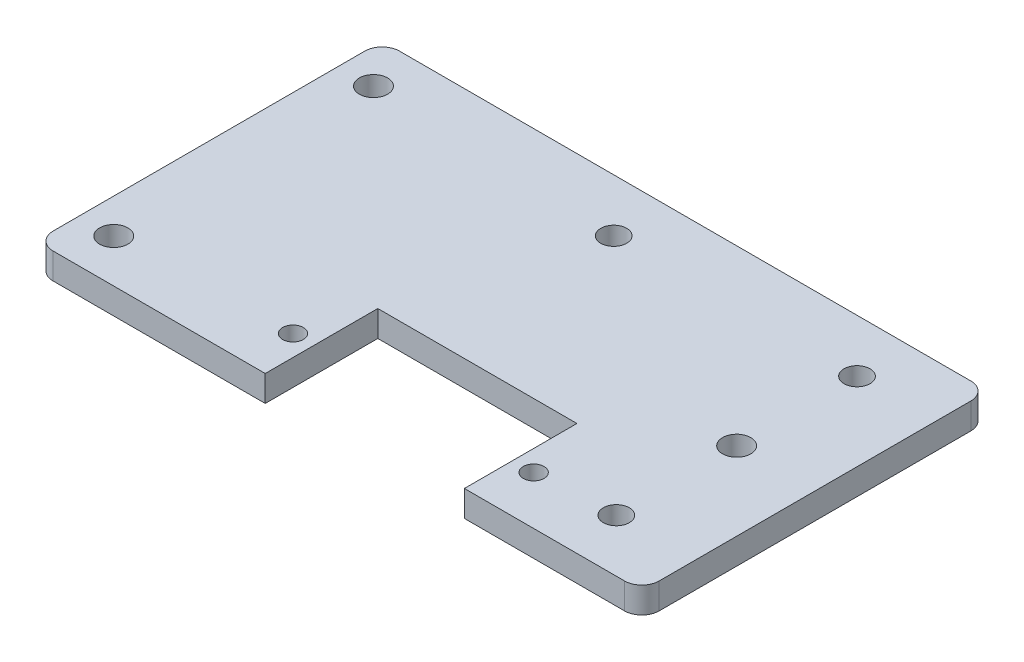
ISO-10303-21;
HEADER;
FILE_DESCRIPTION(('STEP AP214'),'2;1');
FILE_NAME('part.step','',(''),(''),'','','');
FILE_SCHEMA(('AUTOMOTIVE_DESIGN { 1 0 10303 214 1 1 1 1 }'));
ENDSEC;
DATA;
#1=APPLICATION_CONTEXT('core data for automotive mechanical design processes');
#2=APPLICATION_PROTOCOL_DEFINITION('international standard','automotive_design',2000,#1);
#3=PRODUCT_CONTEXT('',#1,'mechanical');
#4=PRODUCT('Part','Part','',(#3));
#5=PRODUCT_RELATED_PRODUCT_CATEGORY('part','',(#4));
#6=PRODUCT_DEFINITION_FORMATION('','',#4);
#7=PRODUCT_DEFINITION_CONTEXT('part definition',#1,'design');
#8=PRODUCT_DEFINITION('design','',#6,#7);
#9=PRODUCT_DEFINITION_SHAPE('','',#8);
#10=(LENGTH_UNIT() NAMED_UNIT(*) SI_UNIT(.MILLI.,.METRE.));
#11=(NAMED_UNIT(*) PLANE_ANGLE_UNIT() SI_UNIT($,.RADIAN.));
#12=(NAMED_UNIT(*) SI_UNIT($,.STERADIAN.) SOLID_ANGLE_UNIT());
#13=UNCERTAINTY_MEASURE_WITH_UNIT(LENGTH_MEASURE(1.E-05),#10,'distance_accuracy_value','');
#14=(GEOMETRIC_REPRESENTATION_CONTEXT(3) GLOBAL_UNCERTAINTY_ASSIGNED_CONTEXT((#13)) GLOBAL_UNIT_ASSIGNED_CONTEXT((#10,
#11,#12)) REPRESENTATION_CONTEXT('',''));
#15=CARTESIAN_POINT('',(0.,0.,0.));
#16=DIRECTION('',(0.,0.,1.));
#17=DIRECTION('',(1.,0.,0.));
#18=AXIS2_PLACEMENT_3D('',#15,#16,#17);
#19=CARTESIAN_POINT('',(-35.,3.,20.));
#20=DIRECTION('',(0.,0.,-1.));
#21=DIRECTION('',(-1.,0.,0.));
#22=AXIS2_PLACEMENT_3D('',#19,#20,#21);
#23=PLANE('',#22);
#24=DIRECTION('',(1.,0.,0.));
#25=VECTOR('',#24,1.);
#26=CARTESIAN_POINT('',(-35.,3.,20.));
#27=LINE('',#26,#25);
#28=CARTESIAN_POINT('',(-33.,3.,20.));
#29=VERTEX_POINT('',#28);
#30=CARTESIAN_POINT('',(-8.49999999999999,3.,20.));
#31=VERTEX_POINT('',#30);
#32=EDGE_CURVE('E119',#29,#31,#27,.T.);
#33=ORIENTED_EDGE('',*,*,#32,.F.);
#34=DIRECTION('',(0.,-1.,0.));
#35=VECTOR('',#34,1.);
#36=CARTESIAN_POINT('',(-33.,3.,20.));
#37=LINE('',#36,#35);
#38=CARTESIAN_POINT('',(-33.,0.,20.));
#39=VERTEX_POINT('',#38);
#40=EDGE_CURVE('E252',#29,#39,#37,.T.);
#41=ORIENTED_EDGE('',*,*,#40,.T.);
#42=DIRECTION('',(1.,0.,0.));
#43=VECTOR('',#42,1.);
#44=CARTESIAN_POINT('',(-35.,0.,20.));
#45=LINE('',#44,#43);
#46=CARTESIAN_POINT('',(-8.49999999999999,0.,20.));
#47=VERTEX_POINT('',#46);
#48=EDGE_CURVE('E144',#39,#47,#45,.T.);
#49=ORIENTED_EDGE('',*,*,#48,.T.);
#50=DIRECTION('',(0.,1.,0.));
#51=VECTOR('',#50,1.);
#52=CARTESIAN_POINT('',(-8.49999999999999,-7.,20.));
#53=LINE('',#52,#51);
#54=EDGE_CURVE('E136',#47,#31,#53,.T.);
#55=ORIENTED_EDGE('',*,*,#54,.T.);
#56=EDGE_LOOP('',(#33,#41,#49,#55));
#57=FACE_BOUND('',#56,.T.);
#58=ADVANCED_FACE('F32',(#57),#23,.F.);
#59=CARTESIAN_POINT('',(35.,3.,-20.));
#60=DIRECTION('',(-1.,0.,0.));
#61=DIRECTION('',(0.,0.,1.));
#62=AXIS2_PLACEMENT_3D('',#59,#60,#61);
#63=PLANE('',#62);
#64=DIRECTION('',(0.,0.,-1.));
#65=VECTOR('',#64,1.);
#66=CARTESIAN_POINT('',(35.,0.,-20.));
#67=LINE('',#66,#65);
#68=CARTESIAN_POINT('',(35.,0.,18.));
#69=VERTEX_POINT('',#68);
#70=CARTESIAN_POINT('',(35.,0.,-18.));
#71=VERTEX_POINT('',#70);
#72=EDGE_CURVE('E201',#69,#71,#67,.T.);
#73=ORIENTED_EDGE('',*,*,#72,.T.);
#74=DIRECTION('',(0.,-1.,0.));
#75=VECTOR('',#74,1.);
#76=CARTESIAN_POINT('',(35.,3.,-18.));
#77=LINE('',#76,#75);
#78=CARTESIAN_POINT('',(35.,3.,-18.));
#79=VERTEX_POINT('',#78);
#80=EDGE_CURVE('E241',#71,#79,#77,.F.);
#81=ORIENTED_EDGE('',*,*,#80,.T.);
#82=DIRECTION('',(0.,0.,-1.));
#83=VECTOR('',#82,1.);
#84=CARTESIAN_POINT('',(35.,3.,-20.));
#85=LINE('',#84,#83);
#86=CARTESIAN_POINT('',(35.,3.,18.));
#87=VERTEX_POINT('',#86);
#88=EDGE_CURVE('E202',#87,#79,#85,.T.);
#89=ORIENTED_EDGE('',*,*,#88,.F.);
#90=DIRECTION('',(0.,-1.,0.));
#91=VECTOR('',#90,1.);
#92=CARTESIAN_POINT('',(35.,3.,18.));
#93=LINE('',#92,#91);
#94=EDGE_CURVE('E238',#87,#69,#93,.T.);
#95=ORIENTED_EDGE('',*,*,#94,.T.);
#96=EDGE_LOOP('',(#73,#81,#89,#95));
#97=FACE_BOUND('',#96,.T.);
#98=ADVANCED_FACE('F274',(#97),#63,.F.);
#99=CARTESIAN_POINT('',(-35.,3.,-20.));
#100=DIRECTION('',(0.,0.,1.));
#101=DIRECTION('',(1.,0.,0.));
#102=AXIS2_PLACEMENT_3D('',#99,#100,#101);
#103=PLANE('',#102);
#104=DIRECTION('',(-1.,0.,0.));
#105=VECTOR('',#104,1.);
#106=CARTESIAN_POINT('',(-35.,3.,-20.));
#107=LINE('',#106,#105);
#108=CARTESIAN_POINT('',(33.,3.,-20.));
#109=VERTEX_POINT('',#108);
#110=CARTESIAN_POINT('',(-33.,3.,-20.));
#111=VERTEX_POINT('',#110);
#112=EDGE_CURVE('E204',#109,#111,#107,.T.);
#113=ORIENTED_EDGE('',*,*,#112,.F.);
#114=DIRECTION('',(0.,-1.,0.));
#115=VECTOR('',#114,1.);
#116=CARTESIAN_POINT('',(33.,3.,-20.));
#117=LINE('',#116,#115);
#118=CARTESIAN_POINT('',(33.,0.,-20.));
#119=VERTEX_POINT('',#118);
#120=EDGE_CURVE('E227',#109,#119,#117,.T.);
#121=ORIENTED_EDGE('',*,*,#120,.T.);
#122=DIRECTION('',(-1.,0.,0.));
#123=VECTOR('',#122,1.);
#124=CARTESIAN_POINT('',(-35.,0.,-20.));
#125=LINE('',#124,#123);
#126=CARTESIAN_POINT('',(-33.,0.,-20.));
#127=VERTEX_POINT('',#126);
#128=EDGE_CURVE('E211',#119,#127,#125,.T.);
#129=ORIENTED_EDGE('',*,*,#128,.T.);
#130=DIRECTION('',(0.,-1.,0.));
#131=VECTOR('',#130,1.);
#132=CARTESIAN_POINT('',(-33.,3.,-20.));
#133=LINE('',#132,#131);
#134=EDGE_CURVE('E225',#127,#111,#133,.F.);
#135=ORIENTED_EDGE('',*,*,#134,.T.);
#136=EDGE_LOOP('',(#113,#121,#129,#135));
#137=FACE_BOUND('',#136,.T.);
#138=ADVANCED_FACE('F280',(#137),#103,.F.);
#139=CARTESIAN_POINT('',(-35.,3.,-20.));
#140=DIRECTION('',(1.,0.,0.));
#141=DIRECTION('',(0.,0.,-1.));
#142=AXIS2_PLACEMENT_3D('',#139,#140,#141);
#143=PLANE('',#142);
#144=DIRECTION('',(0.,0.,1.));
#145=VECTOR('',#144,1.);
#146=CARTESIAN_POINT('',(-35.,0.,-20.));
#147=LINE('',#146,#145);
#148=CARTESIAN_POINT('',(-35.,0.,-18.));
#149=VERTEX_POINT('',#148);
#150=CARTESIAN_POINT('',(-35.,0.,18.));
#151=VERTEX_POINT('',#150);
#152=EDGE_CURVE('E214',#149,#151,#147,.T.);
#153=ORIENTED_EDGE('',*,*,#152,.T.);
#154=DIRECTION('',(0.,-1.,0.));
#155=VECTOR('',#154,1.);
#156=CARTESIAN_POINT('',(-35.,3.,18.));
#157=LINE('',#156,#155);
#158=CARTESIAN_POINT('',(-35.,3.,18.));
#159=VERTEX_POINT('',#158);
#160=EDGE_CURVE('E11',#151,#159,#157,.F.);
#161=ORIENTED_EDGE('',*,*,#160,.T.);
#162=DIRECTION('',(0.,0.,1.));
#163=VECTOR('',#162,1.);
#164=CARTESIAN_POINT('',(-35.,3.,-20.));
#165=LINE('',#164,#163);
#166=CARTESIAN_POINT('',(-35.,3.,-18.));
#167=VERTEX_POINT('',#166);
#168=EDGE_CURVE('E207',#167,#159,#165,.T.);
#169=ORIENTED_EDGE('',*,*,#168,.F.);
#170=DIRECTION('',(0.,-1.,0.));
#171=VECTOR('',#170,1.);
#172=CARTESIAN_POINT('',(-35.,3.,-18.));
#173=LINE('',#172,#171);
#174=EDGE_CURVE('E40',#167,#149,#173,.T.);
#175=ORIENTED_EDGE('',*,*,#174,.T.);
#176=EDGE_LOOP('',(#153,#161,#169,#175));
#177=FACE_BOUND('',#176,.T.);
#178=ADVANCED_FACE('F256',(#177),#143,.F.);
#179=CARTESIAN_POINT('',(14.5,0.,20.));
#180=VERTEX_POINT('',#179);
#181=CARTESIAN_POINT('',(33.,0.,20.));
#182=VERTEX_POINT('',#181);
#183=EDGE_CURVE('E216',#180,#182,#45,.T.);
#184=ORIENTED_EDGE('',*,*,#183,.T.);
#185=DIRECTION('',(0.,-1.,0.));
#186=VECTOR('',#185,1.);
#187=CARTESIAN_POINT('',(33.,3.,20.));
#188=LINE('',#187,#186);
#189=CARTESIAN_POINT('',(33.,3.,20.));
#190=VERTEX_POINT('',#189);
#191=EDGE_CURVE('E250',#182,#190,#188,.F.);
#192=ORIENTED_EDGE('',*,*,#191,.T.);
#193=CARTESIAN_POINT('',(14.5,3.,20.));
#194=VERTEX_POINT('',#193);
#195=EDGE_CURVE('E131',#194,#190,#27,.T.);
#196=ORIENTED_EDGE('',*,*,#195,.F.);
#197=DIRECTION('',(0.,1.,0.));
#198=VECTOR('',#197,1.);
#199=CARTESIAN_POINT('',(14.5,-7.,20.));
#200=LINE('',#199,#198);
#201=EDGE_CURVE('E145',#180,#194,#200,.T.);
#202=ORIENTED_EDGE('',*,*,#201,.F.);
#203=EDGE_LOOP('',(#184,#192,#196,#202));
#204=FACE_BOUND('',#203,.T.);
#205=ADVANCED_FACE('F276',(#204),#23,.F.);
#206=CARTESIAN_POINT('',(0.,3.,0.));
#207=DIRECTION('',(0.,1.,0.));
#208=DIRECTION('',(0.,0.,1.));
#209=AXIS2_PLACEMENT_3D('',#206,#207,#208);
#210=PLANE('',#209);
#211=ORIENTED_EDGE('',*,*,#88,.T.);
#212=CARTESIAN_POINT('',(33.,3.,-18.));
#213=DIRECTION('',(0.,1.,0.));
#214=DIRECTION('',(0.,0.,1.));
#215=AXIS2_PLACEMENT_3D('',#212,#213,#214);
#216=CIRCLE('',#215,2.);
#217=EDGE_CURVE('E248',#79,#109,#216,.T.);
#218=ORIENTED_EDGE('',*,*,#217,.T.);
#219=ORIENTED_EDGE('',*,*,#112,.T.);
#220=CARTESIAN_POINT('',(-33.,3.,-18.));
#221=DIRECTION('',(0.,1.,0.));
#222=DIRECTION('',(0.,0.,1.));
#223=AXIS2_PLACEMENT_3D('',#220,#221,#222);
#224=CIRCLE('',#223,2.);
#225=EDGE_CURVE('E243',#111,#167,#224,.T.);
#226=ORIENTED_EDGE('',*,*,#225,.T.);
#227=ORIENTED_EDGE('',*,*,#168,.T.);
#228=CARTESIAN_POINT('',(-33.,3.,18.));
#229=DIRECTION('',(0.,1.,0.));
#230=DIRECTION('',(0.,0.,1.));
#231=AXIS2_PLACEMENT_3D('',#228,#229,#230);
#232=CIRCLE('',#231,2.);
#233=EDGE_CURVE('E47',#159,#29,#232,.T.);
#234=ORIENTED_EDGE('',*,*,#233,.T.);
#235=ORIENTED_EDGE('',*,*,#32,.T.);
#236=DIRECTION('',(0.,0.,1.));
#237=VECTOR('',#236,1.);
#238=CARTESIAN_POINT('',(-8.49999999999999,3.,20.));
#239=LINE('',#238,#237);
#240=CARTESIAN_POINT('',(-8.49999999999999,3.,7.));
#241=VERTEX_POINT('',#240);
#242=EDGE_CURVE('E125',#241,#31,#239,.T.);
#243=ORIENTED_EDGE('',*,*,#242,.F.);
#244=DIRECTION('',(-1.,0.,0.));
#245=VECTOR('',#244,1.);
#246=CARTESIAN_POINT('',(-8.49999999999999,3.,7.));
#247=LINE('',#246,#245);
#248=CARTESIAN_POINT('',(14.5,3.,6.99999999999999));
#249=VERTEX_POINT('',#248);
#250=EDGE_CURVE('E146',#249,#241,#247,.T.);
#251=ORIENTED_EDGE('',*,*,#250,.F.);
#252=DIRECTION('',(0.,0.,-1.));
#253=VECTOR('',#252,1.);
#254=CARTESIAN_POINT('',(14.5,3.,20.));
#255=LINE('',#254,#253);
#256=EDGE_CURVE('E141',#194,#249,#255,.T.);
#257=ORIENTED_EDGE('',*,*,#256,.F.);
#258=ORIENTED_EDGE('',*,*,#195,.T.);
#259=CARTESIAN_POINT('',(33.,3.,18.));
#260=DIRECTION('',(0.,1.,0.));
#261=DIRECTION('',(0.,0.,1.));
#262=AXIS2_PLACEMENT_3D('',#259,#260,#261);
#263=CIRCLE('',#262,2.);
#264=EDGE_CURVE('E246',#190,#87,#263,.T.);
#265=ORIENTED_EDGE('',*,*,#264,.T.);
#266=EDGE_LOOP('',(#211,#218,#219,#226,#227,#234,#235,#243,#251,#257,#258,#265));
#267=FACE_BOUND('',#266,.T.);
#268=CARTESIAN_POINT('',(-10.9,3.,14.4));
#269=DIRECTION('',(0.,1.,0.));
#270=DIRECTION('',(0.,0.,1.));
#271=AXIS2_PLACEMENT_3D('',#268,#269,#270);
#272=CIRCLE('',#271,1.2);
#273=CARTESIAN_POINT('',(-10.9,3.,15.6));
#274=VERTEX_POINT('',#273);
#275=EDGE_CURVE('E153',#274,#274,#272,.T.);
#276=ORIENTED_EDGE('',*,*,#275,.F.);
#277=EDGE_LOOP('',(#276));
#278=FACE_BOUND('',#277,.T.);
#279=CARTESIAN_POINT('',(16.9,3.,14.4));
#280=DIRECTION('',(0.,1.,0.));
#281=DIRECTION('',(0.,0.,1.));
#282=AXIS2_PLACEMENT_3D('',#279,#280,#281);
#283=CIRCLE('',#282,1.2);
#284=CARTESIAN_POINT('',(16.9,3.,15.6));
#285=VERTEX_POINT('',#284);
#286=EDGE_CURVE('E159',#285,#285,#283,.T.);
#287=ORIENTED_EDGE('',*,*,#286,.F.);
#288=EDGE_LOOP('',(#287));
#289=FACE_BOUND('',#288,.T.);
#290=CARTESIAN_POINT('',(-31.,3.,-15.));
#291=DIRECTION('',(0.,1.,0.));
#292=DIRECTION('',(0.,0.,1.));
#293=AXIS2_PLACEMENT_3D('',#290,#291,#292);
#294=CIRCLE('',#293,1.63195);
#295=CARTESIAN_POINT('',(-31.,3.,-13.36805));
#296=VERTEX_POINT('',#295);
#297=EDGE_CURVE('E165',#296,#296,#294,.T.);
#298=ORIENTED_EDGE('',*,*,#297,.F.);
#299=EDGE_LOOP('',(#298));
#300=FACE_BOUND('',#299,.T.);
#301=CARTESIAN_POINT('',(-31.,3.,15.));
#302=DIRECTION('',(0.,1.,0.));
#303=DIRECTION('',(0.,0.,1.));
#304=AXIS2_PLACEMENT_3D('',#301,#302,#303);
#305=CIRCLE('',#304,1.63195);
#306=CARTESIAN_POINT('',(-31.,3.,16.63195));
#307=VERTEX_POINT('',#306);
#308=EDGE_CURVE('E171',#307,#307,#305,.T.);
#309=ORIENTED_EDGE('',*,*,#308,.F.);
#310=EDGE_LOOP('',(#309));
#311=FACE_BOUND('',#310,.T.);
#312=CARTESIAN_POINT('',(25.95,3.,0.));
#313=DIRECTION('',(0.,1.,0.));
#314=DIRECTION('',(0.,0.,1.));
#315=AXIS2_PLACEMENT_3D('',#312,#313,#314);
#316=CIRCLE('',#315,1.63195);
#317=CARTESIAN_POINT('',(25.95,3.,1.63195));
#318=VERTEX_POINT('',#317);
#319=EDGE_CURVE('E177',#318,#318,#316,.T.);
#320=ORIENTED_EDGE('',*,*,#319,.F.);
#321=EDGE_LOOP('',(#320));
#322=FACE_BOUND('',#321,.T.);
#323=CARTESIAN_POINT('',(-2.14999999999999,3.,-13.9));
#324=DIRECTION('',(0.,1.,0.));
#325=DIRECTION('',(0.,0.,1.));
#326=AXIS2_PLACEMENT_3D('',#323,#324,#325);
#327=CIRCLE('',#326,1.49999999999999);
#328=CARTESIAN_POINT('',(-2.14999999999999,3.,-12.4));
#329=VERTEX_POINT('',#328);
#330=EDGE_CURVE('E183',#329,#329,#327,.T.);
#331=ORIENTED_EDGE('',*,*,#330,.F.);
#332=EDGE_LOOP('',(#331));
#333=FACE_BOUND('',#332,.T.);
#334=CARTESIAN_POINT('',(25.95,3.,-13.9));
#335=DIRECTION('',(0.,1.,0.));
#336=DIRECTION('',(0.,0.,1.));
#337=AXIS2_PLACEMENT_3D('',#334,#335,#336);
#338=CIRCLE('',#337,1.49999999999999);
#339=CARTESIAN_POINT('',(25.95,3.,-12.4));
#340=VERTEX_POINT('',#339);
#341=EDGE_CURVE('E189',#340,#340,#338,.T.);
#342=ORIENTED_EDGE('',*,*,#341,.F.);
#343=EDGE_LOOP('',(#342));
#344=FACE_BOUND('',#343,.T.);
#345=CARTESIAN_POINT('',(25.95,3.,13.9));
#346=DIRECTION('',(0.,1.,0.));
#347=DIRECTION('',(0.,0.,1.));
#348=AXIS2_PLACEMENT_3D('',#345,#346,#347);
#349=CIRCLE('',#348,1.49999999999999);
#350=CARTESIAN_POINT('',(25.95,3.,15.4));
#351=VERTEX_POINT('',#350);
#352=EDGE_CURVE('E195',#351,#351,#349,.T.);
#353=ORIENTED_EDGE('',*,*,#352,.F.);
#354=EDGE_LOOP('',(#353));
#355=FACE_BOUND('',#354,.T.);
#356=ADVANCED_FACE('F122',(#267,#278,#289,#300,#311,#322,#333,#344,#355),#210,.T.);
#357=CARTESIAN_POINT('',(0.,0.,0.));
#358=DIRECTION('',(0.,1.,0.));
#359=DIRECTION('',(0.,0.,1.));
#360=AXIS2_PLACEMENT_3D('',#357,#358,#359);
#361=PLANE('',#360);
#362=CARTESIAN_POINT('',(-10.9,0.,14.4));
#363=DIRECTION('',(0.,1.,0.));
#364=DIRECTION('',(0.,0.,1.));
#365=AXIS2_PLACEMENT_3D('',#362,#363,#364);
#366=CIRCLE('',#365,1.2);
#367=CARTESIAN_POINT('',(-10.9,0.,15.6));
#368=VERTEX_POINT('',#367);
#369=EDGE_CURVE('E156',#368,#368,#366,.T.);
#370=ORIENTED_EDGE('',*,*,#369,.T.);
#371=EDGE_LOOP('',(#370));
#372=FACE_BOUND('',#371,.T.);
#373=CARTESIAN_POINT('',(16.9,0.,14.4));
#374=DIRECTION('',(0.,1.,0.));
#375=DIRECTION('',(0.,0.,1.));
#376=AXIS2_PLACEMENT_3D('',#373,#374,#375);
#377=CIRCLE('',#376,1.2);
#378=CARTESIAN_POINT('',(16.9,0.,15.6));
#379=VERTEX_POINT('',#378);
#380=EDGE_CURVE('E162',#379,#379,#377,.T.);
#381=ORIENTED_EDGE('',*,*,#380,.T.);
#382=EDGE_LOOP('',(#381));
#383=FACE_BOUND('',#382,.T.);
#384=CARTESIAN_POINT('',(-31.,0.,-15.));
#385=DIRECTION('',(0.,1.,0.));
#386=DIRECTION('',(0.,0.,1.));
#387=AXIS2_PLACEMENT_3D('',#384,#385,#386);
#388=CIRCLE('',#387,1.63195);
#389=CARTESIAN_POINT('',(-31.,0.,-13.36805));
#390=VERTEX_POINT('',#389);
#391=EDGE_CURVE('E168',#390,#390,#388,.T.);
#392=ORIENTED_EDGE('',*,*,#391,.T.);
#393=EDGE_LOOP('',(#392));
#394=FACE_BOUND('',#393,.T.);
#395=CARTESIAN_POINT('',(-31.,0.,15.));
#396=DIRECTION('',(0.,1.,0.));
#397=DIRECTION('',(0.,0.,1.));
#398=AXIS2_PLACEMENT_3D('',#395,#396,#397);
#399=CIRCLE('',#398,1.63195);
#400=CARTESIAN_POINT('',(-31.,0.,16.63195));
#401=VERTEX_POINT('',#400);
#402=EDGE_CURVE('E174',#401,#401,#399,.T.);
#403=ORIENTED_EDGE('',*,*,#402,.T.);
#404=EDGE_LOOP('',(#403));
#405=FACE_BOUND('',#404,.T.);
#406=CARTESIAN_POINT('',(25.95,0.,0.));
#407=DIRECTION('',(0.,1.,0.));
#408=DIRECTION('',(0.,0.,1.));
#409=AXIS2_PLACEMENT_3D('',#406,#407,#408);
#410=CIRCLE('',#409,1.63195);
#411=CARTESIAN_POINT('',(25.95,0.,1.63195));
#412=VERTEX_POINT('',#411);
#413=EDGE_CURVE('E180',#412,#412,#410,.T.);
#414=ORIENTED_EDGE('',*,*,#413,.T.);
#415=EDGE_LOOP('',(#414));
#416=FACE_BOUND('',#415,.T.);
#417=CARTESIAN_POINT('',(-2.14999999999999,0.,-13.9));
#418=DIRECTION('',(0.,1.,0.));
#419=DIRECTION('',(0.,0.,1.));
#420=AXIS2_PLACEMENT_3D('',#417,#418,#419);
#421=CIRCLE('',#420,1.5);
#422=CARTESIAN_POINT('',(-2.14999999999999,0.,-12.4));
#423=VERTEX_POINT('',#422);
#424=EDGE_CURVE('E186',#423,#423,#421,.T.);
#425=ORIENTED_EDGE('',*,*,#424,.T.);
#426=EDGE_LOOP('',(#425));
#427=FACE_BOUND('',#426,.T.);
#428=CARTESIAN_POINT('',(25.95,0.,-13.9));
#429=DIRECTION('',(0.,1.,0.));
#430=DIRECTION('',(0.,0.,1.));
#431=AXIS2_PLACEMENT_3D('',#428,#429,#430);
#432=CIRCLE('',#431,1.5);
#433=CARTESIAN_POINT('',(25.95,0.,-12.4));
#434=VERTEX_POINT('',#433);
#435=EDGE_CURVE('E192',#434,#434,#432,.T.);
#436=ORIENTED_EDGE('',*,*,#435,.T.);
#437=EDGE_LOOP('',(#436));
#438=FACE_BOUND('',#437,.T.);
#439=CARTESIAN_POINT('',(25.95,0.,13.9));
#440=DIRECTION('',(0.,1.,0.));
#441=DIRECTION('',(0.,0.,1.));
#442=AXIS2_PLACEMENT_3D('',#439,#440,#441);
#443=CIRCLE('',#442,1.5);
#444=CARTESIAN_POINT('',(25.95,0.,15.4));
#445=VERTEX_POINT('',#444);
#446=EDGE_CURVE('E198',#445,#445,#443,.T.);
#447=ORIENTED_EDGE('',*,*,#446,.T.);
#448=EDGE_LOOP('',(#447));
#449=FACE_BOUND('',#448,.T.);
#450=ORIENTED_EDGE('',*,*,#128,.F.);
#451=CARTESIAN_POINT('',(33.,0.,-18.));
#452=DIRECTION('',(0.,1.,0.));
#453=DIRECTION('',(0.,0.,1.));
#454=AXIS2_PLACEMENT_3D('',#451,#452,#453);
#455=CIRCLE('',#454,2.);
#456=EDGE_CURVE('E236',#119,#71,#455,.F.);
#457=ORIENTED_EDGE('',*,*,#456,.T.);
#458=ORIENTED_EDGE('',*,*,#72,.F.);
#459=CARTESIAN_POINT('',(33.,0.,18.));
#460=DIRECTION('',(0.,1.,0.));
#461=DIRECTION('',(0.,0.,1.));
#462=AXIS2_PLACEMENT_3D('',#459,#460,#461);
#463=CIRCLE('',#462,2.);
#464=EDGE_CURVE('E234',#69,#182,#463,.F.);
#465=ORIENTED_EDGE('',*,*,#464,.T.);
#466=ORIENTED_EDGE('',*,*,#183,.F.);
#467=DIRECTION('',(0.,0.,-1.));
#468=VECTOR('',#467,1.);
#469=CARTESIAN_POINT('',(14.5,0.,0.));
#470=LINE('',#469,#468);
#471=CARTESIAN_POINT('',(14.5,0.,6.99999999999999));
#472=VERTEX_POINT('',#471);
#473=EDGE_CURVE('E130',#180,#472,#470,.T.);
#474=ORIENTED_EDGE('',*,*,#473,.T.);
#475=DIRECTION('',(-1.,0.,0.));
#476=VECTOR('',#475,1.);
#477=CARTESIAN_POINT('',(0.,0.,7.));
#478=LINE('',#477,#476);
#479=CARTESIAN_POINT('',(-8.49999999999999,0.,7.));
#480=VERTEX_POINT('',#479);
#481=EDGE_CURVE('E220',#472,#480,#478,.T.);
#482=ORIENTED_EDGE('',*,*,#481,.T.);
#483=DIRECTION('',(0.,0.,1.));
#484=VECTOR('',#483,1.);
#485=CARTESIAN_POINT('',(-8.49999999999999,0.,0.));
#486=LINE('',#485,#484);
#487=EDGE_CURVE('E223',#480,#47,#486,.T.);
#488=ORIENTED_EDGE('',*,*,#487,.T.);
#489=ORIENTED_EDGE('',*,*,#48,.F.);
#490=CARTESIAN_POINT('',(-33.,0.,18.));
#491=DIRECTION('',(0.,1.,0.));
#492=DIRECTION('',(0.,0.,1.));
#493=AXIS2_PLACEMENT_3D('',#490,#491,#492);
#494=CIRCLE('',#493,2.);
#495=EDGE_CURVE('E232',#39,#151,#494,.F.);
#496=ORIENTED_EDGE('',*,*,#495,.T.);
#497=ORIENTED_EDGE('',*,*,#152,.F.);
#498=CARTESIAN_POINT('',(-33.,0.,-18.));
#499=DIRECTION('',(0.,1.,0.));
#500=DIRECTION('',(0.,0.,1.));
#501=AXIS2_PLACEMENT_3D('',#498,#499,#500);
#502=CIRCLE('',#501,2.);
#503=EDGE_CURVE('E230',#149,#127,#502,.F.);
#504=ORIENTED_EDGE('',*,*,#503,.T.);
#505=EDGE_LOOP('',(#450,#457,#458,#465,#466,#474,#482,#488,#489,#496,#497,#504));
#506=FACE_BOUND('',#505,.T.);
#507=ADVANCED_FACE('F261',(#372,#383,#394,#405,#416,#427,#438,#449,#506),#361,.F.);
#508=CARTESIAN_POINT('',(25.95,3.,13.9));
#509=DIRECTION('',(0.,1.,0.));
#510=DIRECTION('',(0.,0.,1.));
#511=AXIS2_PLACEMENT_3D('',#508,#509,#510);
#512=CYLINDRICAL_SURFACE('',#511,1.49999999999999);
#513=ORIENTED_EDGE('',*,*,#446,.F.);
#514=EDGE_LOOP('',(#513));
#515=FACE_BOUND('',#514,.T.);
#516=ORIENTED_EDGE('',*,*,#352,.T.);
#517=EDGE_LOOP('',(#516));
#518=FACE_BOUND('',#517,.T.);
#519=ADVANCED_FACE('F358',(#515,#518),#512,.F.);
#520=CARTESIAN_POINT('',(25.95,3.,-13.9));
#521=DIRECTION('',(0.,1.,0.));
#522=DIRECTION('',(0.,0.,1.));
#523=AXIS2_PLACEMENT_3D('',#520,#521,#522);
#524=CYLINDRICAL_SURFACE('',#523,1.49999999999999);
#525=ORIENTED_EDGE('',*,*,#435,.F.);
#526=EDGE_LOOP('',(#525));
#527=FACE_BOUND('',#526,.T.);
#528=ORIENTED_EDGE('',*,*,#341,.T.);
#529=EDGE_LOOP('',(#528));
#530=FACE_BOUND('',#529,.T.);
#531=ADVANCED_FACE('F354',(#527,#530),#524,.F.);
#532=CARTESIAN_POINT('',(-2.14999999999999,3.,-13.9));
#533=DIRECTION('',(0.,1.,0.));
#534=DIRECTION('',(0.,0.,1.));
#535=AXIS2_PLACEMENT_3D('',#532,#533,#534);
#536=CYLINDRICAL_SURFACE('',#535,1.49999999999999);
#537=ORIENTED_EDGE('',*,*,#424,.F.);
#538=EDGE_LOOP('',(#537));
#539=FACE_BOUND('',#538,.T.);
#540=ORIENTED_EDGE('',*,*,#330,.T.);
#541=EDGE_LOOP('',(#540));
#542=FACE_BOUND('',#541,.T.);
#543=ADVANCED_FACE('F350',(#539,#542),#536,.F.);
#544=CARTESIAN_POINT('',(25.95,3.,0.));
#545=DIRECTION('',(0.,1.,0.));
#546=DIRECTION('',(0.,0.,1.));
#547=AXIS2_PLACEMENT_3D('',#544,#545,#546);
#548=CYLINDRICAL_SURFACE('',#547,1.63195);
#549=ORIENTED_EDGE('',*,*,#413,.F.);
#550=EDGE_LOOP('',(#549));
#551=FACE_BOUND('',#550,.T.);
#552=ORIENTED_EDGE('',*,*,#319,.T.);
#553=EDGE_LOOP('',(#552));
#554=FACE_BOUND('',#553,.T.);
#555=ADVANCED_FACE('F346',(#551,#554),#548,.F.);
#556=CARTESIAN_POINT('',(-31.,3.,15.));
#557=DIRECTION('',(0.,1.,0.));
#558=DIRECTION('',(0.,0.,1.));
#559=AXIS2_PLACEMENT_3D('',#556,#557,#558);
#560=CYLINDRICAL_SURFACE('',#559,1.63195);
#561=ORIENTED_EDGE('',*,*,#402,.F.);
#562=EDGE_LOOP('',(#561));
#563=FACE_BOUND('',#562,.T.);
#564=ORIENTED_EDGE('',*,*,#308,.T.);
#565=EDGE_LOOP('',(#564));
#566=FACE_BOUND('',#565,.T.);
#567=ADVANCED_FACE('F342',(#563,#566),#560,.F.);
#568=CARTESIAN_POINT('',(-31.,3.,-15.));
#569=DIRECTION('',(0.,1.,0.));
#570=DIRECTION('',(0.,0.,1.));
#571=AXIS2_PLACEMENT_3D('',#568,#569,#570);
#572=CYLINDRICAL_SURFACE('',#571,1.63195);
#573=ORIENTED_EDGE('',*,*,#391,.F.);
#574=EDGE_LOOP('',(#573));
#575=FACE_BOUND('',#574,.T.);
#576=ORIENTED_EDGE('',*,*,#297,.T.);
#577=EDGE_LOOP('',(#576));
#578=FACE_BOUND('',#577,.T.);
#579=ADVANCED_FACE('F338',(#575,#578),#572,.F.);
#580=CARTESIAN_POINT('',(16.9,3.,14.4));
#581=DIRECTION('',(0.,1.,0.));
#582=DIRECTION('',(0.,0.,1.));
#583=AXIS2_PLACEMENT_3D('',#580,#581,#582);
#584=CYLINDRICAL_SURFACE('',#583,1.2);
#585=ORIENTED_EDGE('',*,*,#380,.F.);
#586=EDGE_LOOP('',(#585));
#587=FACE_BOUND('',#586,.T.);
#588=ORIENTED_EDGE('',*,*,#286,.T.);
#589=EDGE_LOOP('',(#588));
#590=FACE_BOUND('',#589,.T.);
#591=ADVANCED_FACE('F334',(#587,#590),#584,.F.);
#592=CARTESIAN_POINT('',(-10.9,3.,14.4));
#593=DIRECTION('',(0.,1.,0.));
#594=DIRECTION('',(0.,0.,1.));
#595=AXIS2_PLACEMENT_3D('',#592,#593,#594);
#596=CYLINDRICAL_SURFACE('',#595,1.2);
#597=ORIENTED_EDGE('',*,*,#369,.F.);
#598=EDGE_LOOP('',(#597));
#599=FACE_BOUND('',#598,.T.);
#600=ORIENTED_EDGE('',*,*,#275,.T.);
#601=EDGE_LOOP('',(#600));
#602=FACE_BOUND('',#601,.T.);
#603=ADVANCED_FACE('F331',(#599,#602),#596,.F.);
#604=CARTESIAN_POINT('',(-8.49999999999999,-7.,20.));
#605=DIRECTION('',(-1.,0.,0.));
#606=DIRECTION('',(0.,0.,1.));
#607=AXIS2_PLACEMENT_3D('',#604,#605,#606);
#608=PLANE('',#607);
#609=DIRECTION('',(0.,1.,0.));
#610=VECTOR('',#609,1.);
#611=CARTESIAN_POINT('',(-8.49999999999999,-7.,7.));
#612=LINE('',#611,#610);
#613=EDGE_CURVE('E139',#480,#241,#612,.T.);
#614=ORIENTED_EDGE('',*,*,#613,.T.);
#615=ORIENTED_EDGE('',*,*,#242,.T.);
#616=ORIENTED_EDGE('',*,*,#54,.F.);
#617=ORIENTED_EDGE('',*,*,#487,.F.);
#618=EDGE_LOOP('',(#614,#615,#616,#617));
#619=FACE_BOUND('',#618,.T.);
#620=ADVANCED_FACE('F135',(#619),#608,.F.);
#621=CARTESIAN_POINT('',(-8.49999999999999,-7.,7.));
#622=DIRECTION('',(0.,0.,-1.));
#623=DIRECTION('',(-1.,0.,0.));
#624=AXIS2_PLACEMENT_3D('',#621,#622,#623);
#625=PLANE('',#624);
#626=DIRECTION('',(0.,1.,0.));
#627=VECTOR('',#626,1.);
#628=CARTESIAN_POINT('',(14.5,-7.,6.99999999999999));
#629=LINE('',#628,#627);
#630=EDGE_CURVE('E148',#472,#249,#629,.T.);
#631=ORIENTED_EDGE('',*,*,#630,.T.);
#632=ORIENTED_EDGE('',*,*,#250,.T.);
#633=ORIENTED_EDGE('',*,*,#613,.F.);
#634=ORIENTED_EDGE('',*,*,#481,.F.);
#635=EDGE_LOOP('',(#631,#632,#633,#634));
#636=FACE_BOUND('',#635,.T.);
#637=ADVANCED_FACE('F320',(#636),#625,.F.);
#638=CARTESIAN_POINT('',(14.5,-7.,20.));
#639=DIRECTION('',(1.,0.,0.));
#640=DIRECTION('',(0.,0.,-1.));
#641=AXIS2_PLACEMENT_3D('',#638,#639,#640);
#642=PLANE('',#641);
#643=ORIENTED_EDGE('',*,*,#201,.T.);
#644=ORIENTED_EDGE('',*,*,#256,.T.);
#645=ORIENTED_EDGE('',*,*,#630,.F.);
#646=ORIENTED_EDGE('',*,*,#473,.F.);
#647=EDGE_LOOP('',(#643,#644,#645,#646));
#648=FACE_BOUND('',#647,.T.);
#649=ADVANCED_FACE('F316',(#648),#642,.F.);
#650=CARTESIAN_POINT('',(33.,3.,-18.));
#651=DIRECTION('',(0.,-1.,0.));
#652=DIRECTION('',(0.,0.,-1.));
#653=AXIS2_PLACEMENT_3D('',#650,#651,#652);
#654=CYLINDRICAL_SURFACE('',#653,2.);
#655=ORIENTED_EDGE('',*,*,#217,.F.);
#656=ORIENTED_EDGE('',*,*,#80,.F.);
#657=ORIENTED_EDGE('',*,*,#456,.F.);
#658=ORIENTED_EDGE('',*,*,#120,.F.);
#659=EDGE_LOOP('',(#655,#656,#657,#658));
#660=FACE_BOUND('',#659,.T.);
#661=ADVANCED_FACE('F270',(#660),#654,.T.);
#662=CARTESIAN_POINT('',(33.,3.,18.));
#663=DIRECTION('',(0.,-1.,0.));
#664=DIRECTION('',(0.,0.,-1.));
#665=AXIS2_PLACEMENT_3D('',#662,#663,#664);
#666=CYLINDRICAL_SURFACE('',#665,2.);
#667=ORIENTED_EDGE('',*,*,#264,.F.);
#668=ORIENTED_EDGE('',*,*,#191,.F.);
#669=ORIENTED_EDGE('',*,*,#464,.F.);
#670=ORIENTED_EDGE('',*,*,#94,.F.);
#671=EDGE_LOOP('',(#667,#668,#669,#670));
#672=FACE_BOUND('',#671,.T.);
#673=ADVANCED_FACE('F265',(#672),#666,.T.);
#674=CARTESIAN_POINT('',(-33.,3.,18.));
#675=DIRECTION('',(0.,-1.,0.));
#676=DIRECTION('',(0.,0.,-1.));
#677=AXIS2_PLACEMENT_3D('',#674,#675,#676);
#678=CYLINDRICAL_SURFACE('',#677,2.);
#679=ORIENTED_EDGE('',*,*,#233,.F.);
#680=ORIENTED_EDGE('',*,*,#160,.F.);
#681=ORIENTED_EDGE('',*,*,#495,.F.);
#682=ORIENTED_EDGE('',*,*,#40,.F.);
#683=EDGE_LOOP('',(#679,#680,#681,#682));
#684=FACE_BOUND('',#683,.T.);
#685=ADVANCED_FACE('F263',(#684),#678,.T.);
#686=CARTESIAN_POINT('',(-33.,3.,-18.));
#687=DIRECTION('',(0.,-1.,0.));
#688=DIRECTION('',(0.,0.,-1.));
#689=AXIS2_PLACEMENT_3D('',#686,#687,#688);
#690=CYLINDRICAL_SURFACE('',#689,2.);
#691=ORIENTED_EDGE('',*,*,#225,.F.);
#692=ORIENTED_EDGE('',*,*,#134,.F.);
#693=ORIENTED_EDGE('',*,*,#503,.F.);
#694=ORIENTED_EDGE('',*,*,#174,.F.);
#695=EDGE_LOOP('',(#691,#692,#693,#694));
#696=FACE_BOUND('',#695,.T.);
#697=ADVANCED_FACE('F34',(#696),#690,.T.);
#698=CLOSED_SHELL('',(#58,#98,#138,#178,#205,#356,#507,#519,#531,#543,#555,#567,#579,#591,#603,
#620,#637,#649,#661,#673,#685,#697));
#699=MANIFOLD_SOLID_BREP('B2',#698);
#700=ADVANCED_BREP_SHAPE_REPRESENTATION('',(#18,#699),#14);
#701=SHAPE_DEFINITION_REPRESENTATION(#9,#700);
ENDSEC;
END-ISO-10303-21;
